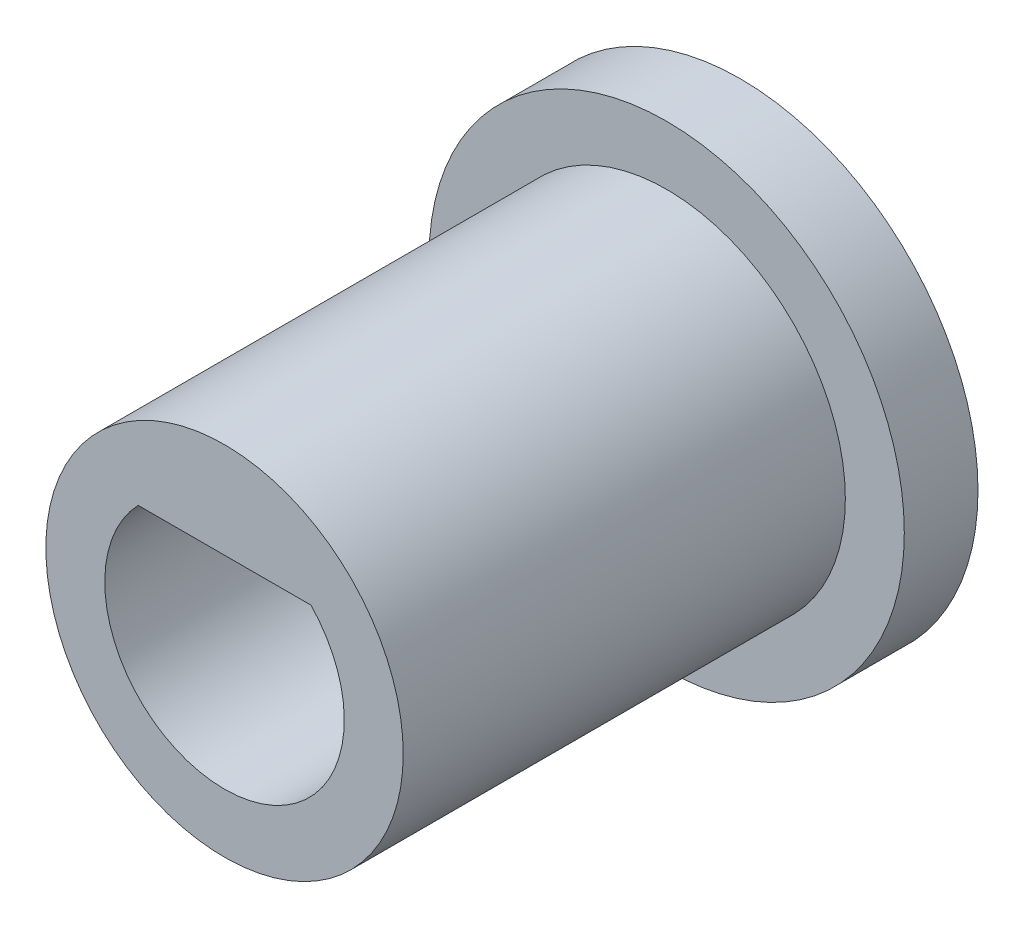
ISO-10303-21;
HEADER;
FILE_DESCRIPTION(('STEP AP214'),'2;1');
FILE_NAME('part.step','',(''),(''),'','','');
FILE_SCHEMA(('AUTOMOTIVE_DESIGN { 1 0 10303 214 1 1 1 1 }'));
ENDSEC;
DATA;
#1=APPLICATION_CONTEXT('core data for automotive mechanical design processes');
#2=APPLICATION_PROTOCOL_DEFINITION('international standard','automotive_design',2000,#1);
#3=PRODUCT_CONTEXT('',#1,'mechanical');
#4=PRODUCT('Part','Part','',(#3));
#5=PRODUCT_RELATED_PRODUCT_CATEGORY('part','',(#4));
#6=PRODUCT_DEFINITION_FORMATION('','',#4);
#7=PRODUCT_DEFINITION_CONTEXT('part definition',#1,'design');
#8=PRODUCT_DEFINITION('design','',#6,#7);
#9=PRODUCT_DEFINITION_SHAPE('','',#8);
#10=(LENGTH_UNIT() NAMED_UNIT(*) SI_UNIT(.MILLI.,.METRE.));
#11=(NAMED_UNIT(*) PLANE_ANGLE_UNIT() SI_UNIT($,.RADIAN.));
#12=(NAMED_UNIT(*) SI_UNIT($,.STERADIAN.) SOLID_ANGLE_UNIT());
#13=UNCERTAINTY_MEASURE_WITH_UNIT(LENGTH_MEASURE(1.E-05),#10,'distance_accuracy_value','');
#14=(GEOMETRIC_REPRESENTATION_CONTEXT(3) GLOBAL_UNCERTAINTY_ASSIGNED_CONTEXT((#13)) GLOBAL_UNIT_ASSIGNED_CONTEXT((#10,
#11,#12)) REPRESENTATION_CONTEXT('',''));
#15=CARTESIAN_POINT('',(0.,0.,0.));
#16=DIRECTION('',(0.,0.,1.));
#17=DIRECTION('',(1.,0.,0.));
#18=AXIS2_PLACEMENT_3D('',#15,#16,#17);
#19=CARTESIAN_POINT('',(0.,1.125,6.));
#20=DIRECTION('',(0.,1.,0.));
#21=DIRECTION('',(0.,0.,1.));
#22=AXIS2_PLACEMENT_3D('',#19,#20,#21);
#23=PLANE('',#22);
#24=DIRECTION('',(0.,0.,-1.));
#25=VECTOR('',#24,1.);
#26=CARTESIAN_POINT('',(-1.17260393995586,1.125,6.));
#27=LINE('',#26,#25);
#28=CARTESIAN_POINT('',(-1.17260393995586,1.125,6.));
#29=VERTEX_POINT('',#28);
#30=CARTESIAN_POINT('',(-1.17260393995586,1.125,-1.));
#31=VERTEX_POINT('',#30);
#32=EDGE_CURVE('E44',#29,#31,#27,.T.);
#33=ORIENTED_EDGE('',*,*,#32,.T.);
#34=DIRECTION('',(1.,0.,0.));
#35=VECTOR('',#34,1.);
#36=CARTESIAN_POINT('',(0.,1.125,-1.));
#37=LINE('',#36,#35);
#38=CARTESIAN_POINT('',(1.17260393995586,1.125,-1.));
#39=VERTEX_POINT('',#38);
#40=EDGE_CURVE('E64',#31,#39,#37,.T.);
#41=ORIENTED_EDGE('',*,*,#40,.T.);
#42=DIRECTION('',(0.,0.,-1.));
#43=VECTOR('',#42,1.);
#44=CARTESIAN_POINT('',(1.17260393995586,1.125,6.));
#45=LINE('',#44,#43);
#46=CARTESIAN_POINT('',(1.17260393995586,1.125,6.));
#47=VERTEX_POINT('',#46);
#48=EDGE_CURVE('E11',#47,#39,#45,.T.);
#49=ORIENTED_EDGE('',*,*,#48,.F.);
#50=DIRECTION('',(1.,0.,0.));
#51=VECTOR('',#50,1.);
#52=CARTESIAN_POINT('',(0.,1.125,6.));
#53=LINE('',#52,#51);
#54=EDGE_CURVE('E56',#29,#47,#53,.T.);
#55=ORIENTED_EDGE('',*,*,#54,.F.);
#56=EDGE_LOOP('',(#33,#41,#49,#55));
#57=FACE_BOUND('',#56,.T.);
#58=ADVANCED_FACE('F37',(#57),#23,.F.);
#59=CARTESIAN_POINT('',(0.,0.,6.));
#60=DIRECTION('',(0.,0.,-1.));
#61=DIRECTION('',(-1.,0.,0.));
#62=AXIS2_PLACEMENT_3D('',#59,#60,#61);
#63=CYLINDRICAL_SURFACE('',#62,1.625);
#64=ORIENTED_EDGE('',*,*,#48,.T.);
#65=CARTESIAN_POINT('',(0.,0.,-1.));
#66=DIRECTION('',(0.,0.,1.));
#67=DIRECTION('',(1.,0.,0.));
#68=AXIS2_PLACEMENT_3D('',#65,#66,#67);
#69=CIRCLE('',#68,1.625);
#70=EDGE_CURVE('E67',#31,#39,#69,.T.);
#71=ORIENTED_EDGE('',*,*,#70,.F.);
#72=ORIENTED_EDGE('',*,*,#32,.F.);
#73=CARTESIAN_POINT('',(0.,0.,6.));
#74=DIRECTION('',(0.,0.,1.));
#75=DIRECTION('',(1.,0.,0.));
#76=AXIS2_PLACEMENT_3D('',#73,#74,#75);
#77=CIRCLE('',#76,1.625);
#78=EDGE_CURVE('E83',#29,#47,#77,.T.);
#79=ORIENTED_EDGE('',*,*,#78,.T.);
#80=EDGE_LOOP('',(#64,#71,#72,#79));
#81=FACE_BOUND('',#80,.T.);
#82=ADVANCED_FACE('F68',(#81),#63,.F.);
#83=CARTESIAN_POINT('',(0.,0.,6.));
#84=DIRECTION('',(0.,0.,-1.));
#85=DIRECTION('',(-1.,0.,0.));
#86=AXIS2_PLACEMENT_3D('',#83,#84,#85);
#87=CYLINDRICAL_SURFACE('',#86,2.425);
#88=CARTESIAN_POINT('',(0.,0.,6.));
#89=DIRECTION('',(0.,0.,1.));
#90=DIRECTION('',(1.,0.,0.));
#91=AXIS2_PLACEMENT_3D('',#88,#89,#90);
#92=CIRCLE('',#91,2.425);
#93=CARTESIAN_POINT('',(2.425,0.,6.));
#94=VERTEX_POINT('',#93);
#95=EDGE_CURVE('E65',#94,#94,#92,.T.);
#96=ORIENTED_EDGE('',*,*,#95,.F.);
#97=EDGE_LOOP('',(#96));
#98=FACE_BOUND('',#97,.T.);
#99=CARTESIAN_POINT('',(0.,0.,0.));
#100=DIRECTION('',(0.,0.,1.));
#101=DIRECTION('',(1.,0.,0.));
#102=AXIS2_PLACEMENT_3D('',#99,#100,#101);
#103=CIRCLE('',#102,2.425);
#104=CARTESIAN_POINT('',(2.425,0.,0.));
#105=VERTEX_POINT('',#104);
#106=EDGE_CURVE('E73',#105,#105,#103,.T.);
#107=ORIENTED_EDGE('',*,*,#106,.T.);
#108=EDGE_LOOP('',(#107));
#109=FACE_BOUND('',#108,.T.);
#110=ADVANCED_FACE('F90',(#98,#109),#87,.T.);
#111=CARTESIAN_POINT('',(0.,0.,6.));
#112=DIRECTION('',(0.,0.,1.));
#113=DIRECTION('',(1.,0.,0.));
#114=AXIS2_PLACEMENT_3D('',#111,#112,#113);
#115=PLANE('',#114);
#116=ORIENTED_EDGE('',*,*,#54,.T.);
#117=ORIENTED_EDGE('',*,*,#78,.F.);
#118=EDGE_LOOP('',(#116,#117));
#119=FACE_BOUND('',#118,.T.);
#120=ORIENTED_EDGE('',*,*,#95,.T.);
#121=EDGE_LOOP('',(#120));
#122=FACE_BOUND('',#121,.T.);
#123=ADVANCED_FACE('F88',(#119,#122),#115,.T.);
#124=CARTESIAN_POINT('',(0.,0.,-1.));
#125=DIRECTION('',(0.,0.,1.));
#126=DIRECTION('',(1.,0.,0.));
#127=AXIS2_PLACEMENT_3D('',#124,#125,#126);
#128=CYLINDRICAL_SURFACE('',#127,3.225);
#129=CARTESIAN_POINT('',(0.,0.,-1.));
#130=DIRECTION('',(0.,0.,1.));
#131=DIRECTION('',(1.,0.,0.));
#132=AXIS2_PLACEMENT_3D('',#129,#130,#131);
#133=CIRCLE('',#132,3.225);
#134=CARTESIAN_POINT('',(3.225,0.,-1.));
#135=VERTEX_POINT('',#134);
#136=EDGE_CURVE('E70',#135,#135,#133,.T.);
#137=ORIENTED_EDGE('',*,*,#136,.T.);
#138=EDGE_LOOP('',(#137));
#139=FACE_BOUND('',#138,.T.);
#140=CARTESIAN_POINT('',(0.,0.,0.));
#141=DIRECTION('',(0.,0.,1.));
#142=DIRECTION('',(1.,0.,0.));
#143=AXIS2_PLACEMENT_3D('',#140,#141,#142);
#144=CIRCLE('',#143,3.225);
#145=CARTESIAN_POINT('',(3.225,0.,0.));
#146=VERTEX_POINT('',#145);
#147=EDGE_CURVE('E79',#146,#146,#144,.T.);
#148=ORIENTED_EDGE('',*,*,#147,.F.);
#149=EDGE_LOOP('',(#148));
#150=FACE_BOUND('',#149,.T.);
#151=ADVANCED_FACE('F102',(#139,#150),#128,.T.);
#152=CARTESIAN_POINT('',(0.,0.,-1.));
#153=DIRECTION('',(0.,0.,1.));
#154=DIRECTION('',(1.,0.,0.));
#155=AXIS2_PLACEMENT_3D('',#152,#153,#154);
#156=PLANE('',#155);
#157=ORIENTED_EDGE('',*,*,#136,.F.);
#158=EDGE_LOOP('',(#157));
#159=FACE_BOUND('',#158,.T.);
#160=ORIENTED_EDGE('',*,*,#70,.T.);
#161=ORIENTED_EDGE('',*,*,#40,.F.);
#162=EDGE_LOOP('',(#160,#161));
#163=FACE_BOUND('',#162,.T.);
#164=ADVANCED_FACE('F72',(#159,#163),#156,.F.);
#165=CARTESIAN_POINT('',(0.,0.,0.));
#166=DIRECTION('',(0.,0.,1.));
#167=DIRECTION('',(1.,0.,0.));
#168=AXIS2_PLACEMENT_3D('',#165,#166,#167);
#169=PLANE('',#168);
#170=ORIENTED_EDGE('',*,*,#106,.F.);
#171=EDGE_LOOP('',(#170));
#172=FACE_BOUND('',#171,.T.);
#173=ORIENTED_EDGE('',*,*,#147,.T.);
#174=EDGE_LOOP('',(#173));
#175=FACE_BOUND('',#174,.T.);
#176=ADVANCED_FACE('F96',(#172,#175),#169,.T.);
#177=CLOSED_SHELL('',(#58,#82,#110,#123,#151,#164,#176));
#178=MANIFOLD_SOLID_BREP('B2',#177);
#179=ADVANCED_BREP_SHAPE_REPRESENTATION('',(#18,#178),#14);
#180=SHAPE_DEFINITION_REPRESENTATION(#9,#179);
ENDSEC;
END-ISO-10303-21;
